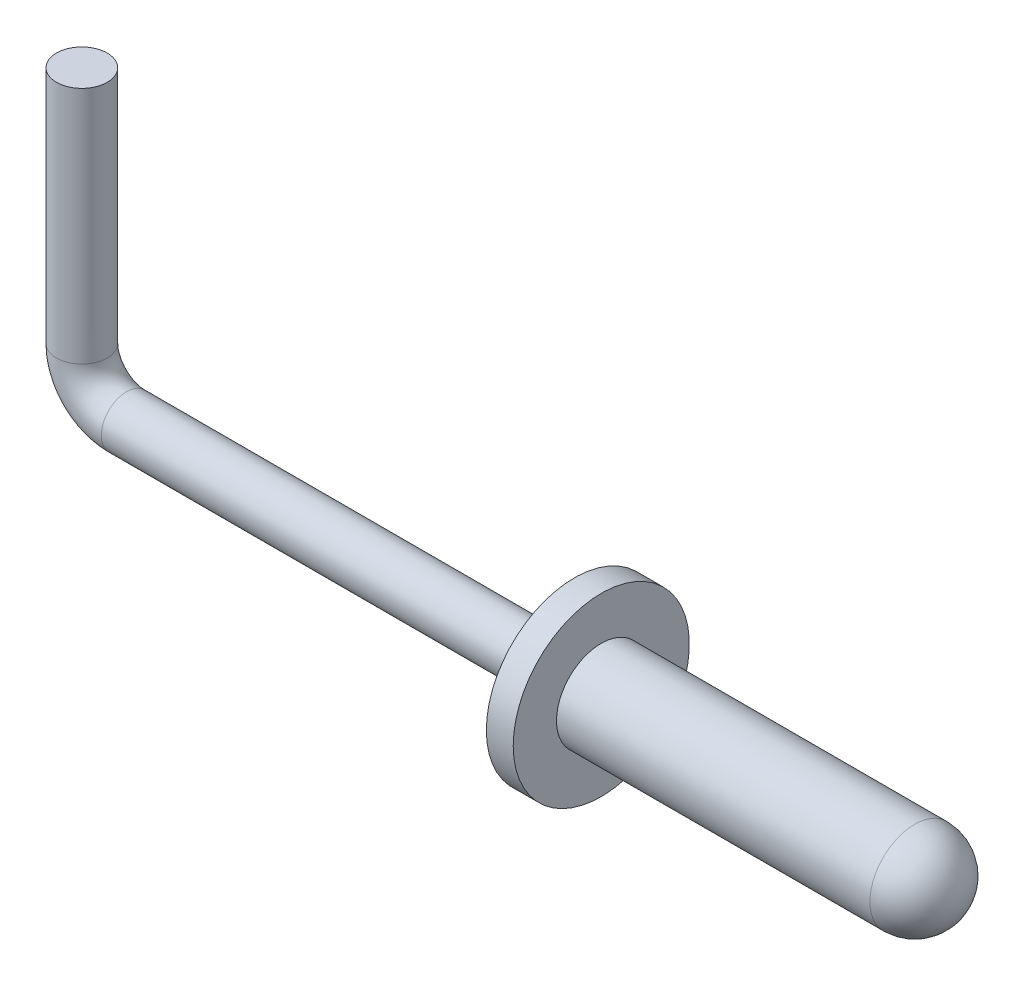
ISO-10303-21;
HEADER;
FILE_DESCRIPTION(('STEP AP214'),'2;1');
FILE_NAME('part.step','',(''),(''),'','','');
FILE_SCHEMA(('AUTOMOTIVE_DESIGN { 1 0 10303 214 1 1 1 1 }'));
ENDSEC;
DATA;
#1=APPLICATION_CONTEXT('core data for automotive mechanical design processes');
#2=APPLICATION_PROTOCOL_DEFINITION('international standard','automotive_design',2000,#1);
#3=PRODUCT_CONTEXT('',#1,'mechanical');
#4=PRODUCT('Part','Part','',(#3));
#5=PRODUCT_RELATED_PRODUCT_CATEGORY('part','',(#4));
#6=PRODUCT_DEFINITION_FORMATION('','',#4);
#7=PRODUCT_DEFINITION_CONTEXT('part definition',#1,'design');
#8=PRODUCT_DEFINITION('design','',#6,#7);
#9=PRODUCT_DEFINITION_SHAPE('','',#8);
#10=(LENGTH_UNIT() NAMED_UNIT(*) SI_UNIT(.MILLI.,.METRE.));
#11=(NAMED_UNIT(*) PLANE_ANGLE_UNIT() SI_UNIT($,.RADIAN.));
#12=(NAMED_UNIT(*) SI_UNIT($,.STERADIAN.) SOLID_ANGLE_UNIT());
#13=UNCERTAINTY_MEASURE_WITH_UNIT(LENGTH_MEASURE(1.E-05),#10,'distance_accuracy_value','');
#14=(GEOMETRIC_REPRESENTATION_CONTEXT(3) GLOBAL_UNCERTAINTY_ASSIGNED_CONTEXT((#13)) GLOBAL_UNIT_ASSIGNED_CONTEXT((#10,
#11,#12)) REPRESENTATION_CONTEXT('',''));
#15=CARTESIAN_POINT('',(0.,0.,0.));
#16=DIRECTION('',(0.,0.,1.));
#17=DIRECTION('',(1.,0.,0.));
#18=AXIS2_PLACEMENT_3D('',#15,#16,#17);
#19=CARTESIAN_POINT('',(10.5,0.,0.));
#20=DIRECTION('',(-1.,0.,0.));
#21=DIRECTION('',(0.,0.,1.));
#22=AXIS2_PLACEMENT_3D('',#19,#20,#21);
#23=CYLINDRICAL_SURFACE('',#22,1.5);
#24=CARTESIAN_POINT('',(10.5,0.,0.));
#25=DIRECTION('',(1.,0.,0.));
#26=DIRECTION('',(0.,0.,-1.));
#27=AXIS2_PLACEMENT_3D('',#24,#25,#26);
#28=CIRCLE('',#27,1.5);
#29=CARTESIAN_POINT('',(10.5,0.,1.5));
#30=VERTEX_POINT('',#29);
#31=EDGE_CURVE('E14',#30,#30,#28,.T.);
#32=CARTESIAN_POINT('',(0.,0.,0.));
#33=DIRECTION('',(1.,0.,0.));
#34=DIRECTION('',(0.,0.,-1.));
#35=AXIS2_PLACEMENT_3D('',#32,#33,#34);
#36=CIRCLE('',#35,1.5);
#37=CARTESIAN_POINT('',(0.,0.,1.5));
#38=VERTEX_POINT('',#37);
#39=EDGE_CURVE('E63',#38,#38,#36,.T.);
#40=CARTESIAN_POINT('',(10.5,0.,1.5));
#41=CARTESIAN_POINT('',(10.390625,0.,1.5));
#42=CARTESIAN_POINT('',(10.28125,0.,1.5));
#43=CARTESIAN_POINT('',(10.0625,0.,1.5));
#44=CARTESIAN_POINT('',(9.953125,0.,1.5));
#45=CARTESIAN_POINT('',(9.734375,0.,1.5));
#46=CARTESIAN_POINT('',(9.625,0.,1.5));
#47=CARTESIAN_POINT('',(9.40625,0.,1.5));
#48=CARTESIAN_POINT('',(9.296875,0.,1.5));
#49=CARTESIAN_POINT('',(9.078125,0.,1.5));
#50=CARTESIAN_POINT('',(8.96875,0.,1.5));
#51=CARTESIAN_POINT('',(8.75,0.,1.5));
#52=CARTESIAN_POINT('',(8.640625,0.,1.5));
#53=CARTESIAN_POINT('',(8.421875,0.,1.5));
#54=CARTESIAN_POINT('',(8.3125,0.,1.5));
#55=CARTESIAN_POINT('',(8.09375,0.,1.5));
#56=CARTESIAN_POINT('',(7.984375,0.,1.5));
#57=CARTESIAN_POINT('',(7.765625,0.,1.5));
#58=CARTESIAN_POINT('',(7.65625,0.,1.5));
#59=CARTESIAN_POINT('',(7.4375,0.,1.5));
#60=CARTESIAN_POINT('',(7.328125,0.,1.5));
#61=CARTESIAN_POINT('',(7.109375,0.,1.5));
#62=CARTESIAN_POINT('',(7.,0.,1.5));
#63=CARTESIAN_POINT('',(6.78125,0.,1.5));
#64=CARTESIAN_POINT('',(6.671875,0.,1.5));
#65=CARTESIAN_POINT('',(6.453125,0.,1.5));
#66=CARTESIAN_POINT('',(6.34375,0.,1.5));
#67=CARTESIAN_POINT('',(6.125,0.,1.5));
#68=CARTESIAN_POINT('',(6.015625,0.,1.5));
#69=CARTESIAN_POINT('',(5.796875,0.,1.5));
#70=CARTESIAN_POINT('',(5.6875,0.,1.5));
#71=CARTESIAN_POINT('',(5.46875,0.,1.5));
#72=CARTESIAN_POINT('',(5.359375,0.,1.5));
#73=CARTESIAN_POINT('',(5.140625,0.,1.5));
#74=CARTESIAN_POINT('',(5.03125,0.,1.5));
#75=CARTESIAN_POINT('',(4.8125,0.,1.5));
#76=CARTESIAN_POINT('',(4.703125,0.,1.5));
#77=CARTESIAN_POINT('',(4.484375,0.,1.5));
#78=CARTESIAN_POINT('',(4.375,0.,1.5));
#79=CARTESIAN_POINT('',(4.15625,0.,1.5));
#80=CARTESIAN_POINT('',(4.046875,0.,1.5));
#81=CARTESIAN_POINT('',(3.828125,0.,1.5));
#82=CARTESIAN_POINT('',(3.71875,0.,1.5));
#83=CARTESIAN_POINT('',(3.5,0.,1.5));
#84=CARTESIAN_POINT('',(3.390625,0.,1.5));
#85=CARTESIAN_POINT('',(3.171875,0.,1.5));
#86=CARTESIAN_POINT('',(3.0625,0.,1.5));
#87=CARTESIAN_POINT('',(2.84375,0.,1.5));
#88=CARTESIAN_POINT('',(2.734375,0.,1.5));
#89=CARTESIAN_POINT('',(2.515625,0.,1.5));
#90=CARTESIAN_POINT('',(2.40625,0.,1.5));
#91=CARTESIAN_POINT('',(2.1875,0.,1.5));
#92=CARTESIAN_POINT('',(2.078125,0.,1.5));
#93=CARTESIAN_POINT('',(1.859375,0.,1.5));
#94=CARTESIAN_POINT('',(1.75,0.,1.5));
#95=CARTESIAN_POINT('',(1.53125,0.,1.5));
#96=CARTESIAN_POINT('',(1.421875,0.,1.5));
#97=CARTESIAN_POINT('',(1.203125,0.,1.5));
#98=CARTESIAN_POINT('',(1.09375,0.,1.5));
#99=CARTESIAN_POINT('',(0.875000000000001,0.,1.5));
#100=CARTESIAN_POINT('',(0.765625000000001,0.,1.5));
#101=CARTESIAN_POINT('',(0.546875,0.,1.5));
#102=CARTESIAN_POINT('',(0.4375,0.,1.5));
#103=CARTESIAN_POINT('',(0.21875,0.,1.5));
#104=CARTESIAN_POINT('',(0.109375,0.,1.5));
#105=CARTESIAN_POINT('',(0.,0.,1.5));
#106=B_SPLINE_CURVE_WITH_KNOTS('',3,(#40,#41,#42,#43,#44,#45,#46,#47,#48,#49,#50,#51,#52,#53,
#54,#55,#56,#57,#58,#59,#60,#61,#62,#63,#64,#65,#66,#67,#68,#69,#70,#71,#72,#73,#74,#75,#76,#77,
#78,#79,#80,#81,#82,#83,#84,#85,#86,#87,#88,#89,#90,#91,#92,#93,#94,#95,#96,#97,#98,#99,#100,
#101,#102,#103,#104,#105),.UNSPECIFIED.,.F.,.F.,(4,2,2,2,2,2,2,2,2,2,2,2,2,2,2,2,2,2,2,2,2,2,2,
2,2,2,2,2,2,2,2,2,4),(0.,0.328124999999999,0.656249999999999,0.984374999999999,1.3125,1.640625,
1.96875,2.296875,2.625,2.953125,3.28125,3.609375,3.9375,4.265625,4.59375,4.921875,5.25,5.578125,
5.90625,6.234375,6.5625,6.890625,7.21875,7.546875,7.875,8.203125,8.53125,8.859375,9.1875,
9.515625,9.84375,10.171875,10.5),.UNSPECIFIED.);
#107=EDGE_CURVE('BSEAM60',#30,#38,#106,.T.);
#108=ORIENTED_EDGE('',*,*,#31,.F.);
#109=ORIENTED_EDGE('',*,*,#39,.T.);
#110=ORIENTED_EDGE('',*,*,#107,.T.);
#111=ORIENTED_EDGE('',*,*,#107,.F.);
#112=EDGE_LOOP('',(#108,#110,#109,#111));
#113=FACE_BOUND('',#112,.T.);
#114=ADVANCED_FACE('F60',(#113),#23,.T.);
#115=CARTESIAN_POINT('',(10.5,0.,0.));
#116=DIRECTION('',(0.,0.,-1.));
#117=DIRECTION('',(0.,-1.,0.));
#118=AXIS2_PLACEMENT_3D('',#115,#116,#117);
#119=SPHERICAL_SURFACE('',#118,1.5);
#120=CARTESIAN_POINT('',(10.5,0.,0.));
#121=DIRECTION('',(1.,0.,0.));
#122=DIRECTION('',(0.,0.,-1.));
#123=AXIS2_PLACEMENT_3D('',#120,#121,#122);
#124=SPHERICAL_SURFACE('',#123,1.5);
#125=ORIENTED_EDGE('',*,*,#31,.T.);
#126=EDGE_LOOP('',(#125));
#127=FACE_BOUND('',#126,.T.);
#128=ADVANCED_FACE('F102',(#127),#124,.T.);
#129=CARTESIAN_POINT('',(-0.9,0.,0.));
#130=DIRECTION('',(1.,0.,0.));
#131=DIRECTION('',(0.,0.,-1.));
#132=AXIS2_PLACEMENT_3D('',#129,#130,#131);
#133=CYLINDRICAL_SURFACE('',#132,2.95);
#134=CARTESIAN_POINT('',(-0.9,0.,0.));
#135=DIRECTION('',(-1.,0.,0.));
#136=DIRECTION('',(0.,0.,1.));
#137=AXIS2_PLACEMENT_3D('',#134,#135,#136);
#138=CIRCLE('',#137,2.95);
#139=CARTESIAN_POINT('',(-0.9,0.,2.95));
#140=VERTEX_POINT('',#139);
#141=EDGE_CURVE('E78',#140,#140,#138,.T.);
#142=ORIENTED_EDGE('',*,*,#141,.F.);
#143=EDGE_LOOP('',(#142));
#144=FACE_BOUND('',#143,.T.);
#145=CARTESIAN_POINT('',(0.,0.,0.));
#146=DIRECTION('',(-1.,0.,0.));
#147=DIRECTION('',(0.,0.,1.));
#148=AXIS2_PLACEMENT_3D('',#145,#146,#147);
#149=CIRCLE('',#148,2.95);
#150=CARTESIAN_POINT('',(0.,0.,2.95));
#151=VERTEX_POINT('',#150);
#152=EDGE_CURVE('E74',#151,#151,#149,.T.);
#153=ORIENTED_EDGE('',*,*,#152,.T.);
#154=EDGE_LOOP('',(#153));
#155=FACE_BOUND('',#154,.T.);
#156=ADVANCED_FACE('F100',(#144,#155),#133,.T.);
#157=CARTESIAN_POINT('',(-0.9,0.,0.));
#158=DIRECTION('',(-1.,0.,0.));
#159=DIRECTION('',(0.,0.,1.));
#160=AXIS2_PLACEMENT_3D('',#157,#158,#159);
#161=PLANE('',#160);
#162=CARTESIAN_POINT('',(-0.9,0.,0.));
#163=DIRECTION('',(1.,0.,0.));
#164=DIRECTION('',(0.,0.,-1.));
#165=AXIS2_PLACEMENT_3D('',#162,#163,#164);
#166=CIRCLE('',#165,0.85);
#167=CARTESIAN_POINT('',(-0.9,0.,-0.85));
#168=VERTEX_POINT('',#167);
#169=EDGE_CURVE('E181',#168,#168,#166,.T.);
#170=ORIENTED_EDGE('',*,*,#169,.T.);
#171=EDGE_LOOP('',(#170));
#172=FACE_BOUND('',#171,.T.);
#173=ORIENTED_EDGE('',*,*,#141,.T.);
#174=EDGE_LOOP('',(#173));
#175=FACE_BOUND('',#174,.T.);
#176=ADVANCED_FACE('F96',(#172,#175),#161,.T.);
#177=CARTESIAN_POINT('',(0.,0.,0.));
#178=DIRECTION('',(-1.,0.,0.));
#179=DIRECTION('',(0.,0.,1.));
#180=AXIS2_PLACEMENT_3D('',#177,#178,#179);
#181=PLANE('',#180);
#182=ORIENTED_EDGE('',*,*,#39,.F.);
#183=EDGE_LOOP('',(#182));
#184=FACE_BOUND('',#183,.T.);
#185=ORIENTED_EDGE('',*,*,#152,.F.);
#186=EDGE_LOOP('',(#185));
#187=FACE_BOUND('',#186,.T.);
#188=ADVANCED_FACE('F92',(#184,#187),#181,.F.);
#189=CARTESIAN_POINT('',(-17.4,9.5,0.));
#190=DIRECTION('',(0.,-1.,0.));
#191=DIRECTION('',(0.,0.,-1.));
#192=AXIS2_PLACEMENT_3D('',#189,#190,#191);
#193=PLANE('',#192);
#194=CARTESIAN_POINT('',(-17.4,9.5,0.));
#195=DIRECTION('',(0.,-1.,0.));
#196=DIRECTION('',(0.,0.,-1.));
#197=AXIS2_PLACEMENT_3D('',#194,#195,#196);
#198=CIRCLE('',#197,0.85);
#199=CARTESIAN_POINT('',(-17.4,9.5,-0.85));
#200=VERTEX_POINT('',#199);
#201=EDGE_CURVE('E70',#200,#200,#198,.T.);
#202=ORIENTED_EDGE('',*,*,#201,.F.);
#203=EDGE_LOOP('',(#202));
#204=FACE_BOUND('',#203,.T.);
#205=ADVANCED_FACE('F95',(#204),#193,.F.);
#206=CARTESIAN_POINT('',(-0.9,0.,0.));
#207=DIRECTION('',(-1.,0.,0.));
#208=DIRECTION('',(0.,-1.,0.));
#209=AXIS2_PLACEMENT_3D('',#206,#207,#208);
#210=CYLINDRICAL_SURFACE('',#209,0.85);
#211=CARTESIAN_POINT('',(-15.9,0.,0.));
#212=DIRECTION('',(1.,0.,0.));
#213=DIRECTION('',(0.,0.,-1.));
#214=AXIS2_PLACEMENT_3D('',#211,#212,#213);
#215=CIRCLE('',#214,0.85);
#216=CARTESIAN_POINT('',(-15.9,-0.850000000000003,0.));
#217=VERTEX_POINT('',#216);
#218=EDGE_CURVE('E81',#217,#217,#215,.T.);
#219=ORIENTED_EDGE('',*,*,#218,.T.);
#220=EDGE_LOOP('',(#219));
#221=FACE_BOUND('',#220,.T.);
#222=ORIENTED_EDGE('',*,*,#169,.F.);
#223=EDGE_LOOP('',(#222));
#224=FACE_BOUND('',#223,.T.);
#225=ADVANCED_FACE('F146',(#221,#224),#210,.T.);
#226=CARTESIAN_POINT('',(-15.9,1.5,0.));
#227=DIRECTION('',(0.,0.,-1.));
#228=DIRECTION('',(-1.,0.,0.));
#229=AXIS2_PLACEMENT_3D('',#226,#227,#228);
#230=TOROIDAL_SURFACE('',#229,1.5,0.85);
#231=CARTESIAN_POINT('',(-17.4,1.5,0.));
#232=DIRECTION('',(0.,-1.,0.));
#233=DIRECTION('',(0.,0.,-1.));
#234=AXIS2_PLACEMENT_3D('',#231,#232,#233);
#235=CIRCLE('',#234,0.85);
#236=CARTESIAN_POINT('',(-18.25,1.5,0.));
#237=VERTEX_POINT('',#236);
#238=EDGE_CURVE('E75',#237,#237,#235,.T.);
#239=CARTESIAN_POINT('',(-15.9,1.5,0.));
#240=DIRECTION('',(0.,0.,-1.));
#241=DIRECTION('',(-1.,0.,0.));
#242=AXIS2_PLACEMENT_3D('',#239,#240,#241);
#243=CIRCLE('',#242,2.35);
#244=EDGE_CURVE('',#217,#237,#243,.T.);
#245=ORIENTED_EDGE('',*,*,#218,.F.);
#246=ORIENTED_EDGE('',*,*,#238,.T.);
#247=ORIENTED_EDGE('',*,*,#244,.T.);
#248=ORIENTED_EDGE('',*,*,#244,.F.);
#249=EDGE_LOOP('',(#245,#247,#246,#248));
#250=FACE_BOUND('',#249,.T.);
#251=ADVANCED_FACE('F155',(#250),#230,.T.);
#252=CARTESIAN_POINT('',(-17.4,1.5,0.));
#253=DIRECTION('',(0.,1.,0.));
#254=DIRECTION('',(0.,0.,1.));
#255=AXIS2_PLACEMENT_3D('',#252,#253,#254);
#256=CYLINDRICAL_SURFACE('',#255,0.85);
#257=ORIENTED_EDGE('',*,*,#201,.T.);
#258=EDGE_LOOP('',(#257));
#259=FACE_BOUND('',#258,.T.);
#260=ORIENTED_EDGE('',*,*,#238,.F.);
#261=EDGE_LOOP('',(#260));
#262=FACE_BOUND('',#261,.T.);
#263=ADVANCED_FACE('F71',(#259,#262),#256,.T.);
#264=CLOSED_SHELL('',(#114,#128,#156,#176,#188,#205,#225,#251,#263));
#265=MANIFOLD_SOLID_BREP('B2',#264);
#266=ADVANCED_BREP_SHAPE_REPRESENTATION('',(#18,#265),#14);
#267=SHAPE_DEFINITION_REPRESENTATION(#9,#266);
ENDSEC;
END-ISO-10303-21;
